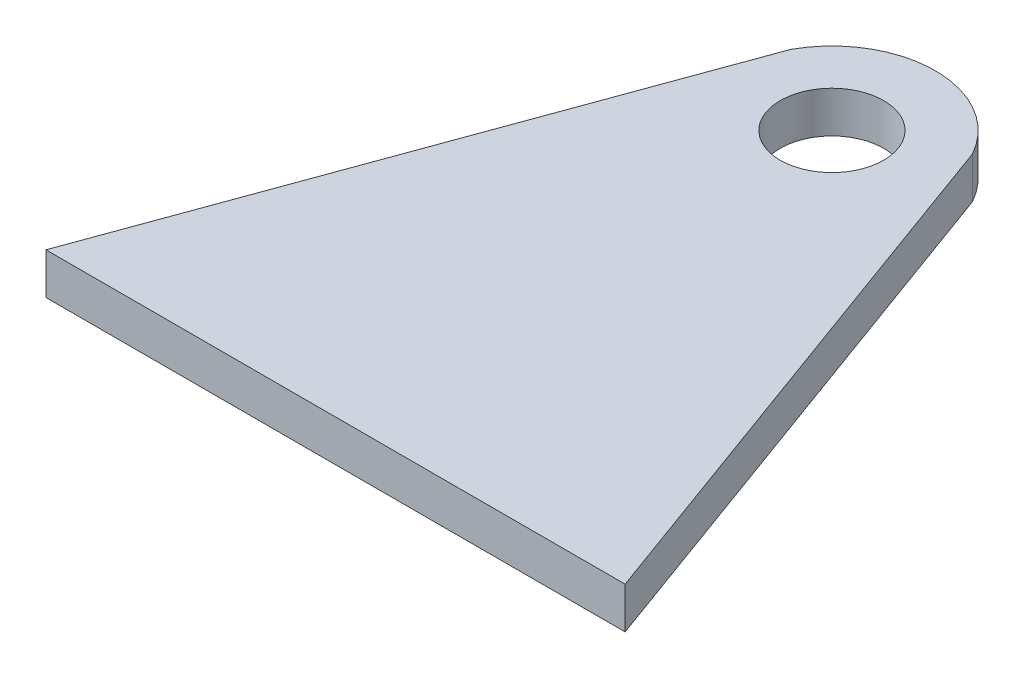
ISO-10303-21;
HEADER;
FILE_DESCRIPTION(('STEP AP214'),'2;1');
FILE_NAME('part.step','',(''),(''),'','','');
FILE_SCHEMA(('AUTOMOTIVE_DESIGN { 1 0 10303 214 1 1 1 1 }'));
ENDSEC;
DATA;
#1=APPLICATION_CONTEXT('core data for automotive mechanical design processes');
#2=APPLICATION_PROTOCOL_DEFINITION('international standard','automotive_design',2000,#1);
#3=PRODUCT_CONTEXT('',#1,'mechanical');
#4=PRODUCT('Part','Part','',(#3));
#5=PRODUCT_RELATED_PRODUCT_CATEGORY('part','',(#4));
#6=PRODUCT_DEFINITION_FORMATION('','',#4);
#7=PRODUCT_DEFINITION_CONTEXT('part definition',#1,'design');
#8=PRODUCT_DEFINITION('design','',#6,#7);
#9=PRODUCT_DEFINITION_SHAPE('','',#8);
#10=(LENGTH_UNIT() NAMED_UNIT(*) SI_UNIT(.MILLI.,.METRE.));
#11=(NAMED_UNIT(*) PLANE_ANGLE_UNIT() SI_UNIT($,.RADIAN.));
#12=(NAMED_UNIT(*) SI_UNIT($,.STERADIAN.) SOLID_ANGLE_UNIT());
#13=UNCERTAINTY_MEASURE_WITH_UNIT(LENGTH_MEASURE(1.E-05),#10,'distance_accuracy_value','');
#14=(GEOMETRIC_REPRESENTATION_CONTEXT(3) GLOBAL_UNCERTAINTY_ASSIGNED_CONTEXT((#13)) GLOBAL_UNIT_ASSIGNED_CONTEXT((#10,
#11,#12)) REPRESENTATION_CONTEXT('',''));
#15=CARTESIAN_POINT('',(0.,0.,0.));
#16=DIRECTION('',(0.,0.,1.));
#17=DIRECTION('',(1.,0.,0.));
#18=AXIS2_PLACEMENT_3D('',#15,#16,#17);
#19=CARTESIAN_POINT('',(0.,10.,0.));
#20=DIRECTION('',(0.,1.,0.));
#21=DIRECTION('',(0.,0.,1.));
#22=AXIS2_PLACEMENT_3D('',#19,#20,#21);
#23=PLANE('',#22);
#24=DIRECTION('',(1.,0.,0.));
#25=VECTOR('',#24,1.);
#26=CARTESIAN_POINT('',(0.,10.,240.));
#27=LINE('',#26,#25);
#28=CARTESIAN_POINT('',(-140.,10.,240.));
#29=VERTEX_POINT('',#28);
#30=CARTESIAN_POINT('',(140.,10.,240.));
#31=VERTEX_POINT('',#30);
#32=EDGE_CURVE('E78',#29,#31,#27,.T.);
#33=ORIENTED_EDGE('',*,*,#32,.T.);
#34=DIRECTION('',(-0.342140256166179,0.,-0.93964889459337));
#35=VECTOR('',#34,1.);
#36=CARTESIAN_POINT('',(140.,10.,240.));
#37=LINE('',#36,#35);
#38=CARTESIAN_POINT('',(43.8940552392635,10.,-23.9439327315393));
#39=VERTEX_POINT('',#38);
#40=EDGE_CURVE('E81',#31,#39,#37,.T.);
#41=ORIENTED_EDGE('',*,*,#40,.T.);
#42=CARTESIAN_POINT('',(0.,10.,0.));
#43=DIRECTION('',(0.,1.,0.));
#44=DIRECTION('',(0.,0.,1.));
#45=AXIS2_PLACEMENT_3D('',#42,#43,#44);
#46=CIRCLE('',#45,50.);
#47=CARTESIAN_POINT('',(-43.8940552392635,10.,-23.9439327315394));
#48=VERTEX_POINT('',#47);
#49=EDGE_CURVE('E85',#39,#48,#46,.T.);
#50=ORIENTED_EDGE('',*,*,#49,.T.);
#51=DIRECTION('',(-0.342140256166179,0.,0.93964889459337));
#52=VECTOR('',#51,1.);
#53=CARTESIAN_POINT('',(-140.,10.,240.));
#54=LINE('',#53,#52);
#55=EDGE_CURVE('E49',#48,#29,#54,.T.);
#56=ORIENTED_EDGE('',*,*,#55,.T.);
#57=EDGE_LOOP('',(#33,#41,#50,#56));
#58=FACE_BOUND('',#57,.T.);
#59=CARTESIAN_POINT('',(0.,10.,0.));
#60=DIRECTION('',(0.,1.,0.));
#61=DIRECTION('',(0.,0.,1.));
#62=AXIS2_PLACEMENT_3D('',#59,#60,#61);
#63=CIRCLE('',#62,25.);
#64=CARTESIAN_POINT('',(0.,10.,25.));
#65=VERTEX_POINT('',#64);
#66=EDGE_CURVE('E98',#65,#65,#63,.T.);
#67=ORIENTED_EDGE('',*,*,#66,.F.);
#68=EDGE_LOOP('',(#67));
#69=FACE_BOUND('',#68,.T.);
#70=ADVANCED_FACE('F32',(#58,#69),#23,.T.);
#71=CARTESIAN_POINT('',(0.,-10.,0.));
#72=DIRECTION('',(0.,1.,0.));
#73=DIRECTION('',(0.,0.,1.));
#74=AXIS2_PLACEMENT_3D('',#71,#72,#73);
#75=PLANE('',#74);
#76=DIRECTION('',(1.,0.,0.));
#77=VECTOR('',#76,1.);
#78=CARTESIAN_POINT('',(0.,-10.,240.));
#79=LINE('',#78,#77);
#80=CARTESIAN_POINT('',(-140.,-10.,240.));
#81=VERTEX_POINT('',#80);
#82=CARTESIAN_POINT('',(140.,-10.,240.));
#83=VERTEX_POINT('',#82);
#84=EDGE_CURVE('E73',#81,#83,#79,.T.);
#85=ORIENTED_EDGE('',*,*,#84,.F.);
#86=DIRECTION('',(-0.342140256166179,0.,0.93964889459337));
#87=VECTOR('',#86,1.);
#88=CARTESIAN_POINT('',(-140.,-10.,240.));
#89=LINE('',#88,#87);
#90=CARTESIAN_POINT('',(-43.8940552392635,-10.,-23.9439327315394));
#91=VERTEX_POINT('',#90);
#92=EDGE_CURVE('E101',#91,#81,#89,.T.);
#93=ORIENTED_EDGE('',*,*,#92,.F.);
#94=CARTESIAN_POINT('',(0.,-10.,0.));
#95=DIRECTION('',(0.,1.,0.));
#96=DIRECTION('',(0.,0.,1.));
#97=AXIS2_PLACEMENT_3D('',#94,#95,#96);
#98=CIRCLE('',#97,50.);
#99=CARTESIAN_POINT('',(43.8940552392635,-10.,-23.9439327315393));
#100=VERTEX_POINT('',#99);
#101=EDGE_CURVE('E66',#100,#91,#98,.T.);
#102=ORIENTED_EDGE('',*,*,#101,.F.);
#103=DIRECTION('',(-0.342140256166179,0.,-0.93964889459337));
#104=VECTOR('',#103,1.);
#105=CARTESIAN_POINT('',(140.,-10.,240.));
#106=LINE('',#105,#104);
#107=EDGE_CURVE('E89',#83,#100,#106,.T.);
#108=ORIENTED_EDGE('',*,*,#107,.F.);
#109=EDGE_LOOP('',(#85,#93,#102,#108));
#110=FACE_BOUND('',#109,.T.);
#111=CARTESIAN_POINT('',(0.,-10.,0.));
#112=DIRECTION('',(0.,1.,0.));
#113=DIRECTION('',(0.,0.,1.));
#114=AXIS2_PLACEMENT_3D('',#111,#112,#113);
#115=CIRCLE('',#114,25.);
#116=CARTESIAN_POINT('',(0.,-10.,25.));
#117=VERTEX_POINT('',#116);
#118=EDGE_CURVE('E113',#117,#117,#115,.T.);
#119=ORIENTED_EDGE('',*,*,#118,.T.);
#120=EDGE_LOOP('',(#119));
#121=FACE_BOUND('',#120,.T.);
#122=ADVANCED_FACE('F107',(#110,#121),#75,.F.);
#123=CARTESIAN_POINT('',(0.,10.,240.));
#124=DIRECTION('',(0.,0.,-1.));
#125=DIRECTION('',(-1.,0.,0.));
#126=AXIS2_PLACEMENT_3D('',#123,#124,#125);
#127=PLANE('',#126);
#128=ORIENTED_EDGE('',*,*,#84,.T.);
#129=DIRECTION('',(0.,-1.,0.));
#130=VECTOR('',#129,1.);
#131=CARTESIAN_POINT('',(140.,10.,240.));
#132=LINE('',#131,#130);
#133=EDGE_CURVE('E11',#31,#83,#132,.T.);
#134=ORIENTED_EDGE('',*,*,#133,.F.);
#135=ORIENTED_EDGE('',*,*,#32,.F.);
#136=DIRECTION('',(0.,-1.,0.));
#137=VECTOR('',#136,1.);
#138=CARTESIAN_POINT('',(-140.,10.,240.));
#139=LINE('',#138,#137);
#140=EDGE_CURVE('E93',#29,#81,#139,.T.);
#141=ORIENTED_EDGE('',*,*,#140,.T.);
#142=EDGE_LOOP('',(#128,#134,#135,#141));
#143=FACE_BOUND('',#142,.T.);
#144=ADVANCED_FACE('F34',(#143),#127,.F.);
#145=CARTESIAN_POINT('',(140.,10.,240.));
#146=DIRECTION('',(-0.93964889459337,0.,0.342140256166179));
#147=DIRECTION('',(0.342140256166179,0.,0.93964889459337));
#148=AXIS2_PLACEMENT_3D('',#145,#146,#147);
#149=PLANE('',#148);
#150=ORIENTED_EDGE('',*,*,#107,.T.);
#151=DIRECTION('',(0.,-1.,0.));
#152=VECTOR('',#151,1.);
#153=CARTESIAN_POINT('',(43.8940552392635,10.,-23.9439327315393));
#154=LINE('',#153,#152);
#155=EDGE_CURVE('E41',#39,#100,#154,.T.);
#156=ORIENTED_EDGE('',*,*,#155,.F.);
#157=ORIENTED_EDGE('',*,*,#40,.F.);
#158=ORIENTED_EDGE('',*,*,#133,.T.);
#159=EDGE_LOOP('',(#150,#156,#157,#158));
#160=FACE_BOUND('',#159,.T.);
#161=ADVANCED_FACE('F88',(#160),#149,.F.);
#162=CARTESIAN_POINT('',(0.,10.,0.));
#163=DIRECTION('',(0.,-1.,0.));
#164=DIRECTION('',(0.,0.,-1.));
#165=AXIS2_PLACEMENT_3D('',#162,#163,#164);
#166=CYLINDRICAL_SURFACE('',#165,50.);
#167=ORIENTED_EDGE('',*,*,#101,.T.);
#168=DIRECTION('',(0.,-1.,0.));
#169=VECTOR('',#168,1.);
#170=CARTESIAN_POINT('',(-43.8940552392635,10.,-23.9439327315394));
#171=LINE('',#170,#169);
#172=EDGE_CURVE('E90',#48,#91,#171,.T.);
#173=ORIENTED_EDGE('',*,*,#172,.F.);
#174=ORIENTED_EDGE('',*,*,#49,.F.);
#175=ORIENTED_EDGE('',*,*,#155,.T.);
#176=EDGE_LOOP('',(#167,#173,#174,#175));
#177=FACE_BOUND('',#176,.T.);
#178=ADVANCED_FACE('F91',(#177),#166,.T.);
#179=CARTESIAN_POINT('',(-140.,10.,240.));
#180=DIRECTION('',(0.93964889459337,0.,0.342140256166179));
#181=DIRECTION('',(0.342140256166179,0.,-0.93964889459337));
#182=AXIS2_PLACEMENT_3D('',#179,#180,#181);
#183=PLANE('',#182);
#184=ORIENTED_EDGE('',*,*,#92,.T.);
#185=ORIENTED_EDGE('',*,*,#140,.F.);
#186=ORIENTED_EDGE('',*,*,#55,.F.);
#187=ORIENTED_EDGE('',*,*,#172,.T.);
#188=EDGE_LOOP('',(#184,#185,#186,#187));
#189=FACE_BOUND('',#188,.T.);
#190=ADVANCED_FACE('F106',(#189),#183,.F.);
#191=CARTESIAN_POINT('',(0.,10.,0.));
#192=DIRECTION('',(0.,-1.,0.));
#193=DIRECTION('',(0.,0.,-1.));
#194=AXIS2_PLACEMENT_3D('',#191,#192,#193);
#195=CYLINDRICAL_SURFACE('',#194,25.);
#196=ORIENTED_EDGE('',*,*,#66,.T.);
#197=EDGE_LOOP('',(#196));
#198=FACE_BOUND('',#197,.T.);
#199=ORIENTED_EDGE('',*,*,#118,.F.);
#200=EDGE_LOOP('',(#199));
#201=FACE_BOUND('',#200,.T.);
#202=ADVANCED_FACE('F120',(#198,#201),#195,.F.);
#203=CLOSED_SHELL('',(#70,#122,#144,#161,#178,#190,#202));
#204=MANIFOLD_SOLID_BREP('B2',#203);
#205=ADVANCED_BREP_SHAPE_REPRESENTATION('',(#18,#204),#14);
#206=SHAPE_DEFINITION_REPRESENTATION(#9,#205);
ENDSEC;
END-ISO-10303-21;
